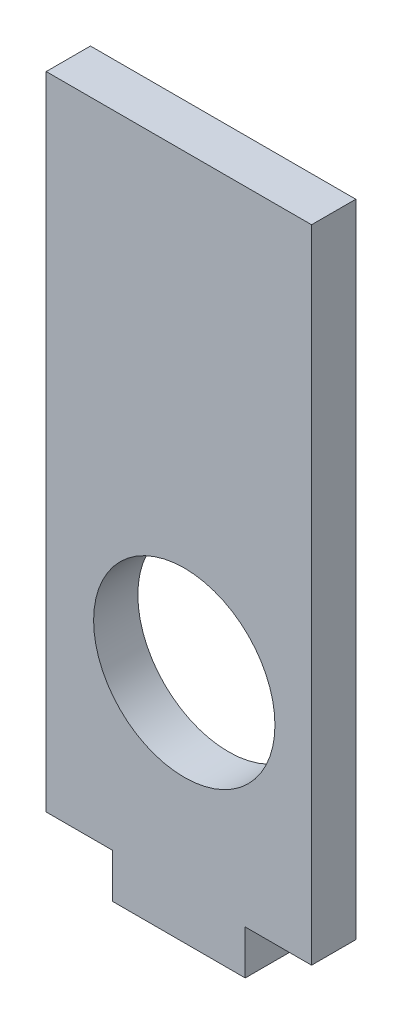
ISO-10303-21;
HEADER;
FILE_DESCRIPTION(('STEP AP214'),'2;1');
FILE_NAME('part.step','',(''),(''),'','','');
FILE_SCHEMA(('AUTOMOTIVE_DESIGN { 1 0 10303 214 1 1 1 1 }'));
ENDSEC;
DATA;
#1=APPLICATION_CONTEXT('core data for automotive mechanical design processes');
#2=APPLICATION_PROTOCOL_DEFINITION('international standard','automotive_design',2000,#1);
#3=PRODUCT_CONTEXT('',#1,'mechanical');
#4=PRODUCT('Part','Part','',(#3));
#5=PRODUCT_RELATED_PRODUCT_CATEGORY('part','',(#4));
#6=PRODUCT_DEFINITION_FORMATION('','',#4);
#7=PRODUCT_DEFINITION_CONTEXT('part definition',#1,'design');
#8=PRODUCT_DEFINITION('design','',#6,#7);
#9=PRODUCT_DEFINITION_SHAPE('','',#8);
#10=(LENGTH_UNIT() NAMED_UNIT(*) SI_UNIT(.MILLI.,.METRE.));
#11=(NAMED_UNIT(*) PLANE_ANGLE_UNIT() SI_UNIT($,.RADIAN.));
#12=(NAMED_UNIT(*) SI_UNIT($,.STERADIAN.) SOLID_ANGLE_UNIT());
#13=UNCERTAINTY_MEASURE_WITH_UNIT(LENGTH_MEASURE(1.E-05),#10,'distance_accuracy_value','');
#14=(GEOMETRIC_REPRESENTATION_CONTEXT(3) GLOBAL_UNCERTAINTY_ASSIGNED_CONTEXT((#13)) GLOBAL_UNIT_ASSIGNED_CONTEXT((#10,
#11,#12)) REPRESENTATION_CONTEXT('',''));
#15=CARTESIAN_POINT('',(0.,0.,0.));
#16=DIRECTION('',(0.,0.,1.));
#17=DIRECTION('',(1.,0.,0.));
#18=AXIS2_PLACEMENT_3D('',#15,#16,#17);
#19=CARTESIAN_POINT('',(-6.,0.,2.));
#20=DIRECTION('',(-1.,0.,0.));
#21=DIRECTION('',(0.,0.,1.));
#22=AXIS2_PLACEMENT_3D('',#19,#20,#21);
#23=PLANE('',#22);
#24=DIRECTION('',(0.,1.,0.));
#25=VECTOR('',#24,1.);
#26=CARTESIAN_POINT('',(-6.,15.,2.));
#27=LINE('',#26,#25);
#28=CARTESIAN_POINT('',(-6.,0.,2.));
#29=VERTEX_POINT('',#28);
#30=CARTESIAN_POINT('',(-6.00000000000002,29.0000003609943,2.00000000000001));
#31=VERTEX_POINT('',#30);
#32=EDGE_CURVE('E60',#29,#31,#27,.T.);
#33=ORIENTED_EDGE('',*,*,#32,.T.);
#34=DIRECTION('',(0.,0.,-1.));
#35=VECTOR('',#34,1.);
#36=CARTESIAN_POINT('',(-6.,29.0000003609943,2.));
#37=LINE('',#36,#35);
#38=CARTESIAN_POINT('',(-6.,29.0000003609943,0.));
#39=VERTEX_POINT('',#38);
#40=EDGE_CURVE('E164',#31,#39,#37,.T.);
#41=ORIENTED_EDGE('',*,*,#40,.T.);
#42=DIRECTION('',(0.,1.,0.));
#43=VECTOR('',#42,1.);
#44=CARTESIAN_POINT('',(-6.,0.,0.));
#45=LINE('',#44,#43);
#46=CARTESIAN_POINT('',(-6.,0.,0.));
#47=VERTEX_POINT('',#46);
#48=EDGE_CURVE('E151',#47,#39,#45,.T.);
#49=ORIENTED_EDGE('',*,*,#48,.F.);
#50=DIRECTION('',(0.,0.,-1.));
#51=VECTOR('',#50,1.);
#52=CARTESIAN_POINT('',(-6.,0.,2.));
#53=LINE('',#52,#51);
#54=EDGE_CURVE('E45',#29,#47,#53,.T.);
#55=ORIENTED_EDGE('',*,*,#54,.F.);
#56=EDGE_LOOP('',(#33,#41,#49,#55));
#57=FACE_BOUND('',#56,.T.);
#58=ADVANCED_FACE('F37',(#57),#23,.T.);
#59=CARTESIAN_POINT('',(6.,0.,2.));
#60=DIRECTION('',(-1.,0.,0.));
#61=DIRECTION('',(0.,0.,1.));
#62=AXIS2_PLACEMENT_3D('',#59,#60,#61);
#63=PLANE('',#62);
#64=DIRECTION('',(0.,0.,-1.));
#65=VECTOR('',#64,1.);
#66=CARTESIAN_POINT('',(6.,29.0000003609943,2.));
#67=LINE('',#66,#65);
#68=CARTESIAN_POINT('',(6.00000000000002,29.0000003609943,2.));
#69=VERTEX_POINT('',#68);
#70=CARTESIAN_POINT('',(6.,29.0000003609943,0.));
#71=VERTEX_POINT('',#70);
#72=EDGE_CURVE('E52',#69,#71,#67,.T.);
#73=ORIENTED_EDGE('',*,*,#72,.F.);
#74=DIRECTION('',(0.,-1.,0.));
#75=VECTOR('',#74,1.);
#76=CARTESIAN_POINT('',(6.,30.0787744086171,2.));
#77=LINE('',#76,#75);
#78=CARTESIAN_POINT('',(6.,0.,2.));
#79=VERTEX_POINT('',#78);
#80=EDGE_CURVE('E93',#69,#79,#77,.T.);
#81=ORIENTED_EDGE('',*,*,#80,.T.);
#82=DIRECTION('',(0.,0.,-1.));
#83=VECTOR('',#82,1.);
#84=CARTESIAN_POINT('',(6.,0.,2.));
#85=LINE('',#84,#83);
#86=CARTESIAN_POINT('',(6.,0.,0.));
#87=VERTEX_POINT('',#86);
#88=EDGE_CURVE('E136',#79,#87,#85,.T.);
#89=ORIENTED_EDGE('',*,*,#88,.T.);
#90=DIRECTION('',(0.,1.,0.));
#91=VECTOR('',#90,1.);
#92=CARTESIAN_POINT('',(6.,0.,0.));
#93=LINE('',#92,#91);
#94=EDGE_CURVE('E137',#87,#71,#93,.T.);
#95=ORIENTED_EDGE('',*,*,#94,.T.);
#96=EDGE_LOOP('',(#73,#81,#89,#95));
#97=FACE_BOUND('',#96,.T.);
#98=ADVANCED_FACE('F39',(#97),#63,.F.);
#99=CARTESIAN_POINT('',(0.,0.,2.));
#100=DIRECTION('',(0.,0.,-1.));
#101=DIRECTION('',(-1.,0.,0.));
#102=AXIS2_PLACEMENT_3D('',#99,#100,#101);
#103=PLANE('',#102);
#104=CARTESIAN_POINT('',(0.243619750883461,8.5794462268636,2.));
#105=DIRECTION('',(0.,0.,1.));
#106=DIRECTION('',(1.,0.,0.));
#107=AXIS2_PLACEMENT_3D('',#104,#105,#106);
#108=CIRCLE('',#107,4.1);
#109=CARTESIAN_POINT('',(4.34361975088346,8.5794462268636,2.));
#110=VERTEX_POINT('',#109);
#111=EDGE_CURVE('E160',#110,#110,#108,.T.);
#112=ORIENTED_EDGE('',*,*,#111,.F.);
#113=EDGE_LOOP('',(#112));
#114=FACE_BOUND('',#113,.T.);
#115=DIRECTION('',(-1.,0.,0.));
#116=VECTOR('',#115,1.);
#117=CARTESIAN_POINT('',(0.,29.0000003609943,2.00000000000001));
#118=LINE('',#117,#116);
#119=EDGE_CURVE('E189',#69,#31,#118,.T.);
#120=ORIENTED_EDGE('',*,*,#119,.T.);
#121=ORIENTED_EDGE('',*,*,#32,.F.);
#122=DIRECTION('',(1.,0.,0.));
#123=VECTOR('',#122,1.);
#124=CARTESIAN_POINT('',(-6.,0.,2.));
#125=LINE('',#124,#123);
#126=CARTESIAN_POINT('',(-3.,0.,2.));
#127=VERTEX_POINT('',#126);
#128=EDGE_CURVE('E111',#29,#127,#125,.T.);
#129=ORIENTED_EDGE('',*,*,#128,.T.);
#130=DIRECTION('',(0.,-1.,0.));
#131=VECTOR('',#130,1.);
#132=CARTESIAN_POINT('',(-3.,0.,2.));
#133=LINE('',#132,#131);
#134=CARTESIAN_POINT('',(-3.,-2.,2.));
#135=VERTEX_POINT('',#134);
#136=EDGE_CURVE('E104',#127,#135,#133,.T.);
#137=ORIENTED_EDGE('',*,*,#136,.T.);
#138=DIRECTION('',(1.,0.,0.));
#139=VECTOR('',#138,1.);
#140=CARTESIAN_POINT('',(-3.,-2.,2.));
#141=LINE('',#140,#139);
#142=CARTESIAN_POINT('',(3.,-2.,2.));
#143=VERTEX_POINT('',#142);
#144=EDGE_CURVE('E109',#135,#143,#141,.T.);
#145=ORIENTED_EDGE('',*,*,#144,.T.);
#146=DIRECTION('',(0.,-1.,0.));
#147=VECTOR('',#146,1.);
#148=CARTESIAN_POINT('',(3.,0.,2.));
#149=LINE('',#148,#147);
#150=CARTESIAN_POINT('',(3.,0.,2.));
#151=VERTEX_POINT('',#150);
#152=EDGE_CURVE('E129',#151,#143,#149,.T.);
#153=ORIENTED_EDGE('',*,*,#152,.F.);
#154=DIRECTION('',(1.,0.,0.));
#155=VECTOR('',#154,1.);
#156=CARTESIAN_POINT('',(3.,0.,2.));
#157=LINE('',#156,#155);
#158=EDGE_CURVE('E131',#151,#79,#157,.T.);
#159=ORIENTED_EDGE('',*,*,#158,.T.);
#160=ORIENTED_EDGE('',*,*,#80,.F.);
#161=EDGE_LOOP('',(#120,#121,#129,#137,#145,#153,#159,#160));
#162=FACE_BOUND('',#161,.T.);
#163=ADVANCED_FACE('F106',(#114,#162),#103,.F.);
#164=CARTESIAN_POINT('',(0.,0.,0.));
#165=DIRECTION('',(0.,0.,-1.));
#166=DIRECTION('',(-1.,0.,0.));
#167=AXIS2_PLACEMENT_3D('',#164,#165,#166);
#168=PLANE('',#167);
#169=CARTESIAN_POINT('',(0.243619750883461,8.5794462268636,0.));
#170=DIRECTION('',(0.,0.,-1.));
#171=DIRECTION('',(-1.,0.,0.));
#172=AXIS2_PLACEMENT_3D('',#169,#170,#171);
#173=CIRCLE('',#172,4.1);
#174=CARTESIAN_POINT('',(-3.85638024911654,8.5794462268636,0.));
#175=VERTEX_POINT('',#174);
#176=EDGE_CURVE('E141',#175,#175,#173,.T.);
#177=ORIENTED_EDGE('',*,*,#176,.F.);
#178=EDGE_LOOP('',(#177));
#179=FACE_BOUND('',#178,.T.);
#180=ORIENTED_EDGE('',*,*,#48,.T.);
#181=DIRECTION('',(1.,0.,0.));
#182=VECTOR('',#181,1.);
#183=CARTESIAN_POINT('',(0.,29.0000003609943,0.));
#184=LINE('',#183,#182);
#185=EDGE_CURVE('E11',#39,#71,#184,.T.);
#186=ORIENTED_EDGE('',*,*,#185,.T.);
#187=ORIENTED_EDGE('',*,*,#94,.F.);
#188=DIRECTION('',(1.,0.,0.));
#189=VECTOR('',#188,1.);
#190=CARTESIAN_POINT('',(3.,0.,0.));
#191=LINE('',#190,#189);
#192=CARTESIAN_POINT('',(3.,0.,0.));
#193=VERTEX_POINT('',#192);
#194=EDGE_CURVE('E140',#193,#87,#191,.T.);
#195=ORIENTED_EDGE('',*,*,#194,.F.);
#196=DIRECTION('',(0.,-1.,0.));
#197=VECTOR('',#196,1.);
#198=CARTESIAN_POINT('',(3.,0.,0.));
#199=LINE('',#198,#197);
#200=CARTESIAN_POINT('',(3.,-2.,0.));
#201=VERTEX_POINT('',#200);
#202=EDGE_CURVE('E143',#193,#201,#199,.T.);
#203=ORIENTED_EDGE('',*,*,#202,.T.);
#204=DIRECTION('',(1.,0.,0.));
#205=VECTOR('',#204,1.);
#206=CARTESIAN_POINT('',(-3.,-2.,0.));
#207=LINE('',#206,#205);
#208=CARTESIAN_POINT('',(-3.,-2.,0.));
#209=VERTEX_POINT('',#208);
#210=EDGE_CURVE('E146',#209,#201,#207,.T.);
#211=ORIENTED_EDGE('',*,*,#210,.F.);
#212=DIRECTION('',(0.,-1.,0.));
#213=VECTOR('',#212,1.);
#214=CARTESIAN_POINT('',(-3.,0.,0.));
#215=LINE('',#214,#213);
#216=CARTESIAN_POINT('',(-3.,0.,0.));
#217=VERTEX_POINT('',#216);
#218=EDGE_CURVE('E120',#217,#209,#215,.T.);
#219=ORIENTED_EDGE('',*,*,#218,.F.);
#220=DIRECTION('',(1.,0.,0.));
#221=VECTOR('',#220,1.);
#222=CARTESIAN_POINT('',(-6.,0.,0.));
#223=LINE('',#222,#221);
#224=EDGE_CURVE('E149',#47,#217,#223,.T.);
#225=ORIENTED_EDGE('',*,*,#224,.F.);
#226=EDGE_LOOP('',(#180,#186,#187,#195,#203,#211,#219,#225));
#227=FACE_BOUND('',#226,.T.);
#228=ADVANCED_FACE('F181',(#179,#227),#168,.T.);
#229=CARTESIAN_POINT('',(-6.,0.,2.));
#230=DIRECTION('',(0.,1.,0.));
#231=DIRECTION('',(-1.,0.,0.));
#232=AXIS2_PLACEMENT_3D('',#229,#230,#231);
#233=PLANE('',#232);
#234=ORIENTED_EDGE('',*,*,#224,.T.);
#235=DIRECTION('',(0.,0.,-1.));
#236=VECTOR('',#235,1.);
#237=CARTESIAN_POINT('',(-3.,0.,2.));
#238=LINE('',#237,#236);
#239=EDGE_CURVE('E124',#127,#217,#238,.T.);
#240=ORIENTED_EDGE('',*,*,#239,.F.);
#241=ORIENTED_EDGE('',*,*,#128,.F.);
#242=ORIENTED_EDGE('',*,*,#54,.T.);
#243=EDGE_LOOP('',(#234,#240,#241,#242));
#244=FACE_BOUND('',#243,.T.);
#245=ADVANCED_FACE('F191',(#244),#233,.F.);
#246=CARTESIAN_POINT('',(-3.,0.,2.));
#247=DIRECTION('',(1.,0.,0.));
#248=DIRECTION('',(0.,1.,0.));
#249=AXIS2_PLACEMENT_3D('',#246,#247,#248);
#250=PLANE('',#249);
#251=ORIENTED_EDGE('',*,*,#218,.T.);
#252=DIRECTION('',(0.,0.,-1.));
#253=VECTOR('',#252,1.);
#254=CARTESIAN_POINT('',(-3.,-2.,2.));
#255=LINE('',#254,#253);
#256=EDGE_CURVE('E117',#135,#209,#255,.T.);
#257=ORIENTED_EDGE('',*,*,#256,.F.);
#258=ORIENTED_EDGE('',*,*,#136,.F.);
#259=ORIENTED_EDGE('',*,*,#239,.T.);
#260=EDGE_LOOP('',(#251,#257,#258,#259));
#261=FACE_BOUND('',#260,.T.);
#262=ADVANCED_FACE('F118',(#261),#250,.F.);
#263=CARTESIAN_POINT('',(-3.,-2.,2.));
#264=DIRECTION('',(0.,1.,0.));
#265=DIRECTION('',(-1.,0.,0.));
#266=AXIS2_PLACEMENT_3D('',#263,#264,#265);
#267=PLANE('',#266);
#268=ORIENTED_EDGE('',*,*,#210,.T.);
#269=DIRECTION('',(0.,0.,-1.));
#270=VECTOR('',#269,1.);
#271=CARTESIAN_POINT('',(3.,-2.,2.));
#272=LINE('',#271,#270);
#273=EDGE_CURVE('E125',#143,#201,#272,.T.);
#274=ORIENTED_EDGE('',*,*,#273,.F.);
#275=ORIENTED_EDGE('',*,*,#144,.F.);
#276=ORIENTED_EDGE('',*,*,#256,.T.);
#277=EDGE_LOOP('',(#268,#274,#275,#276));
#278=FACE_BOUND('',#277,.T.);
#279=ADVANCED_FACE('F127',(#278),#267,.F.);
#280=CARTESIAN_POINT('',(3.,0.,2.));
#281=DIRECTION('',(1.,0.,0.));
#282=DIRECTION('',(0.,0.,-1.));
#283=AXIS2_PLACEMENT_3D('',#280,#281,#282);
#284=PLANE('',#283);
#285=ORIENTED_EDGE('',*,*,#202,.F.);
#286=DIRECTION('',(0.,0.,-1.));
#287=VECTOR('',#286,1.);
#288=CARTESIAN_POINT('',(3.,0.,2.));
#289=LINE('',#288,#287);
#290=EDGE_CURVE('E157',#151,#193,#289,.T.);
#291=ORIENTED_EDGE('',*,*,#290,.F.);
#292=ORIENTED_EDGE('',*,*,#152,.T.);
#293=ORIENTED_EDGE('',*,*,#273,.T.);
#294=EDGE_LOOP('',(#285,#291,#292,#293));
#295=FACE_BOUND('',#294,.T.);
#296=ADVANCED_FACE('F193',(#295),#284,.T.);
#297=CARTESIAN_POINT('',(3.,0.,2.));
#298=DIRECTION('',(0.,1.,0.));
#299=DIRECTION('',(-1.,0.,0.));
#300=AXIS2_PLACEMENT_3D('',#297,#298,#299);
#301=PLANE('',#300);
#302=ORIENTED_EDGE('',*,*,#194,.T.);
#303=ORIENTED_EDGE('',*,*,#88,.F.);
#304=ORIENTED_EDGE('',*,*,#158,.F.);
#305=ORIENTED_EDGE('',*,*,#290,.T.);
#306=EDGE_LOOP('',(#302,#303,#304,#305));
#307=FACE_BOUND('',#306,.T.);
#308=ADVANCED_FACE('F177',(#307),#301,.F.);
#309=CARTESIAN_POINT('',(0.243619750883461,8.5794462268636,-8.));
#310=DIRECTION('',(0.,0.,1.));
#311=DIRECTION('',(1.,0.,0.));
#312=AXIS2_PLACEMENT_3D('',#309,#310,#311);
#313=CYLINDRICAL_SURFACE('',#312,4.1);
#314=ORIENTED_EDGE('',*,*,#176,.T.);
#315=EDGE_LOOP('',(#314));
#316=FACE_BOUND('',#315,.T.);
#317=ORIENTED_EDGE('',*,*,#111,.T.);
#318=EDGE_LOOP('',(#317));
#319=FACE_BOUND('',#318,.T.);
#320=ADVANCED_FACE('F200',(#316,#319),#313,.F.);
#321=CARTESIAN_POINT('',(0.,29.0000003609943,-7.99999999999999));
#322=DIRECTION('',(0.,1.,0.));
#323=DIRECTION('',(-1.,0.,0.));
#324=AXIS2_PLACEMENT_3D('',#321,#322,#323);
#325=PLANE('',#324);
#326=ORIENTED_EDGE('',*,*,#119,.F.);
#327=ORIENTED_EDGE('',*,*,#72,.T.);
#328=ORIENTED_EDGE('',*,*,#185,.F.);
#329=ORIENTED_EDGE('',*,*,#40,.F.);
#330=EDGE_LOOP('',(#326,#327,#328,#329));
#331=FACE_BOUND('',#330,.T.);
#332=ADVANCED_FACE('F185',(#331),#325,.T.);
#333=CLOSED_SHELL('',(#58,#98,#163,#228,#245,#262,#279,#296,#308,#320,#332));
#334=MANIFOLD_SOLID_BREP('B2',#333);
#335=ADVANCED_BREP_SHAPE_REPRESENTATION('',(#18,#334),#14);
#336=SHAPE_DEFINITION_REPRESENTATION(#9,#335);
ENDSEC;
END-ISO-10303-21;
